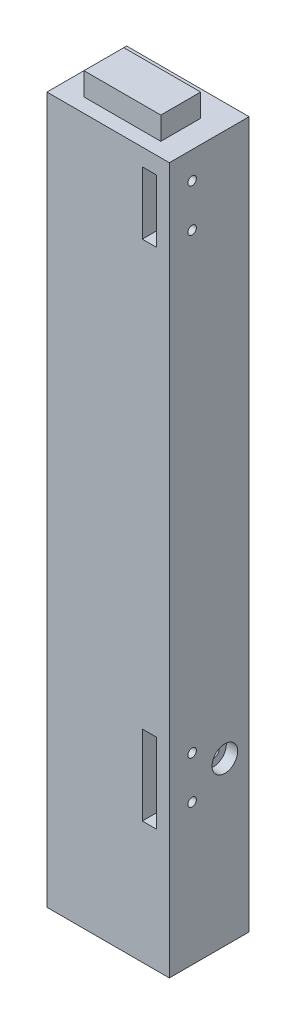
ISO-10303-21;
HEADER;
FILE_DESCRIPTION(('STEP AP214'),'2;1');
FILE_NAME('part.step','',(''),(''),'','','');
FILE_SCHEMA(('AUTOMOTIVE_DESIGN { 1 0 10303 214 1 1 1 1 }'));
ENDSEC;
DATA;
#1=APPLICATION_CONTEXT('core data for automotive mechanical design processes');
#2=APPLICATION_PROTOCOL_DEFINITION('international standard','automotive_design',2000,#1);
#3=PRODUCT_CONTEXT('',#1,'mechanical');
#4=PRODUCT('Part','Part','',(#3));
#5=PRODUCT_RELATED_PRODUCT_CATEGORY('part','',(#4));
#6=PRODUCT_DEFINITION_FORMATION('','',#4);
#7=PRODUCT_DEFINITION_CONTEXT('part definition',#1,'design');
#8=PRODUCT_DEFINITION('design','',#6,#7);
#9=PRODUCT_DEFINITION_SHAPE('','',#8);
#10=(LENGTH_UNIT() NAMED_UNIT(*) SI_UNIT(.MILLI.,.METRE.));
#11=(NAMED_UNIT(*) PLANE_ANGLE_UNIT() SI_UNIT($,.RADIAN.));
#12=(NAMED_UNIT(*) SI_UNIT($,.STERADIAN.) SOLID_ANGLE_UNIT());
#13=UNCERTAINTY_MEASURE_WITH_UNIT(LENGTH_MEASURE(1.E-05),#10,'distance_accuracy_value','');
#14=(GEOMETRIC_REPRESENTATION_CONTEXT(3) GLOBAL_UNCERTAINTY_ASSIGNED_CONTEXT((#13)) GLOBAL_UNIT_ASSIGNED_CONTEXT((#10,
#11,#12)) REPRESENTATION_CONTEXT('',''));
#15=CARTESIAN_POINT('',(0.,0.,0.));
#16=DIRECTION('',(0.,0.,1.));
#17=DIRECTION('',(1.,0.,0.));
#18=AXIS2_PLACEMENT_3D('',#15,#16,#17);
#19=CARTESIAN_POINT('',(68.2625,393.7,88.9));
#20=DIRECTION('',(0.,-1.,0.));
#21=DIRECTION('',(0.,0.,-1.));
#22=AXIS2_PLACEMENT_3D('',#19,#20,#21);
#23=PLANE('',#22);
#24=DIRECTION('',(-1.,0.,0.));
#25=VECTOR('',#24,1.);
#26=CARTESIAN_POINT('',(68.2625,393.7,0.));
#27=LINE('',#26,#25);
#28=CARTESIAN_POINT('',(68.2625,393.7,0.));
#29=VERTEX_POINT('',#28);
#30=CARTESIAN_POINT('',(-68.2625,393.7,0.));
#31=VERTEX_POINT('',#30);
#32=EDGE_CURVE('E305',#29,#31,#27,.T.);
#33=ORIENTED_EDGE('',*,*,#32,.T.);
#34=DIRECTION('',(0.,0.,-1.));
#35=VECTOR('',#34,1.);
#36=CARTESIAN_POINT('',(-68.2625,393.7,88.9));
#37=LINE('',#36,#35);
#38=CARTESIAN_POINT('',(-68.2625,393.7,88.9));
#39=VERTEX_POINT('',#38);
#40=EDGE_CURVE('E311',#39,#31,#37,.T.);
#41=ORIENTED_EDGE('',*,*,#40,.F.);
#42=DIRECTION('',(-1.,0.,0.));
#43=VECTOR('',#42,1.);
#44=CARTESIAN_POINT('',(68.2625,393.7,88.9));
#45=LINE('',#44,#43);
#46=CARTESIAN_POINT('',(68.2625,393.7,88.9));
#47=VERTEX_POINT('',#46);
#48=EDGE_CURVE('E309',#47,#39,#45,.T.);
#49=ORIENTED_EDGE('',*,*,#48,.F.);
#50=DIRECTION('',(0.,0.,-1.));
#51=VECTOR('',#50,1.);
#52=CARTESIAN_POINT('',(68.2625,393.7,88.9));
#53=LINE('',#52,#51);
#54=EDGE_CURVE('E321',#47,#29,#53,.T.);
#55=ORIENTED_EDGE('',*,*,#54,.T.);
#56=EDGE_LOOP('',(#33,#41,#49,#55));
#57=FACE_BOUND('',#56,.T.);
#58=DIRECTION('',(0.,0.,1.));
#59=VECTOR('',#58,1.);
#60=CARTESIAN_POINT('',(-42.8625,393.7,73.025));
#61=LINE('',#60,#59);
#62=CARTESIAN_POINT('',(-42.8625,393.7,28.575));
#63=VERTEX_POINT('',#62);
#64=CARTESIAN_POINT('',(-42.8625,393.7,73.025));
#65=VERTEX_POINT('',#64);
#66=EDGE_CURVE('E261',#63,#65,#61,.T.);
#67=ORIENTED_EDGE('',*,*,#66,.F.);
#68=DIRECTION('',(-1.,0.,0.));
#69=VECTOR('',#68,1.);
#70=CARTESIAN_POINT('',(42.8625,393.7,28.575));
#71=LINE('',#70,#69);
#72=CARTESIAN_POINT('',(42.8625,393.7,28.575));
#73=VERTEX_POINT('',#72);
#74=EDGE_CURVE('E272',#73,#63,#71,.T.);
#75=ORIENTED_EDGE('',*,*,#74,.F.);
#76=DIRECTION('',(0.,0.,-1.));
#77=VECTOR('',#76,1.);
#78=CARTESIAN_POINT('',(42.8625,393.7,73.025));
#79=LINE('',#78,#77);
#80=CARTESIAN_POINT('',(42.8625,393.7,73.025));
#81=VERTEX_POINT('',#80);
#82=EDGE_CURVE('E284',#81,#73,#79,.T.);
#83=ORIENTED_EDGE('',*,*,#82,.F.);
#84=DIRECTION('',(1.,0.,0.));
#85=VECTOR('',#84,1.);
#86=CARTESIAN_POINT('',(42.8625,393.7,73.025));
#87=LINE('',#86,#85);
#88=EDGE_CURVE('E281',#65,#81,#87,.T.);
#89=ORIENTED_EDGE('',*,*,#88,.F.);
#90=EDGE_LOOP('',(#67,#75,#83,#89));
#91=FACE_BOUND('',#90,.T.);
#92=ADVANCED_FACE('F33',(#57,#91),#23,.F.);
#93=CARTESIAN_POINT('',(-68.2625,393.7,88.9));
#94=DIRECTION('',(1.,0.,0.));
#95=DIRECTION('',(0.,1.,0.));
#96=AXIS2_PLACEMENT_3D('',#93,#94,#95);
#97=PLANE('',#96);
#98=DIRECTION('',(0.,0.,1.));
#99=VECTOR('',#98,1.);
#100=CARTESIAN_POINT('',(-68.2625,-254.,39.6875));
#101=LINE('',#100,#99);
#102=CARTESIAN_POINT('',(-68.2625,-254.,14.2875));
#103=VERTEX_POINT('',#102);
#104=CARTESIAN_POINT('',(-68.2625,-254.,39.6875));
#105=VERTEX_POINT('',#104);
#106=EDGE_CURVE('E251',#103,#105,#101,.T.);
#107=ORIENTED_EDGE('',*,*,#106,.F.);
#108=DIRECTION('',(0.,-1.,0.));
#109=VECTOR('',#108,1.);
#110=CARTESIAN_POINT('',(-68.2625,-171.45,14.2875));
#111=LINE('',#110,#109);
#112=CARTESIAN_POINT('',(-68.2625,-171.45,14.2875));
#113=VERTEX_POINT('',#112);
#114=EDGE_CURVE('E230',#113,#103,#111,.T.);
#115=ORIENTED_EDGE('',*,*,#114,.F.);
#116=DIRECTION('',(0.,0.,-1.));
#117=VECTOR('',#116,1.);
#118=CARTESIAN_POINT('',(-68.2625,-171.45,39.6875));
#119=LINE('',#118,#117);
#120=CARTESIAN_POINT('',(-68.2625,-171.45,39.6875));
#121=VERTEX_POINT('',#120);
#122=EDGE_CURVE('E240',#121,#113,#119,.T.);
#123=ORIENTED_EDGE('',*,*,#122,.F.);
#124=DIRECTION('',(0.,1.,0.));
#125=VECTOR('',#124,1.);
#126=CARTESIAN_POINT('',(-68.2625,-171.45,39.6875));
#127=LINE('',#126,#125);
#128=EDGE_CURVE('E254',#105,#121,#127,.T.);
#129=ORIENTED_EDGE('',*,*,#128,.F.);
#130=EDGE_LOOP('',(#107,#115,#123,#129));
#131=FACE_BOUND('',#130,.T.);
#132=DIRECTION('',(0.,-1.,0.));
#133=VECTOR('',#132,1.);
#134=CARTESIAN_POINT('',(-68.2625,393.7,0.));
#135=LINE('',#134,#133);
#136=CARTESIAN_POINT('',(-68.2625,-393.7,0.));
#137=VERTEX_POINT('',#136);
#138=EDGE_CURVE('E300',#31,#137,#135,.T.);
#139=ORIENTED_EDGE('',*,*,#138,.T.);
#140=DIRECTION('',(0.,0.,-1.));
#141=VECTOR('',#140,1.);
#142=CARTESIAN_POINT('',(-68.2625,-393.7,88.9));
#143=LINE('',#142,#141);
#144=CARTESIAN_POINT('',(-68.2625,-393.7,88.9));
#145=VERTEX_POINT('',#144);
#146=EDGE_CURVE('E11',#145,#137,#143,.T.);
#147=ORIENTED_EDGE('',*,*,#146,.F.);
#148=DIRECTION('',(0.,-1.,0.));
#149=VECTOR('',#148,1.);
#150=CARTESIAN_POINT('',(-68.2625,393.7,88.9));
#151=LINE('',#150,#149);
#152=EDGE_CURVE('E301',#39,#145,#151,.T.);
#153=ORIENTED_EDGE('',*,*,#152,.F.);
#154=ORIENTED_EDGE('',*,*,#40,.T.);
#155=EDGE_LOOP('',(#139,#147,#153,#154));
#156=FACE_BOUND('',#155,.T.);
#157=ADVANCED_FACE('F35',(#131,#156),#97,.F.);
#158=CARTESIAN_POINT('',(68.2625000000001,-393.7,88.9));
#159=DIRECTION('',(0.,1.,0.));
#160=DIRECTION('',(-1.,0.,0.));
#161=AXIS2_PLACEMENT_3D('',#158,#159,#160);
#162=PLANE('',#161);
#163=DIRECTION('',(1.,0.,0.));
#164=VECTOR('',#163,1.);
#165=CARTESIAN_POINT('',(68.2625000000001,-393.7,0.));
#166=LINE('',#165,#164);
#167=CARTESIAN_POINT('',(68.2625000000001,-393.7,0.));
#168=VERTEX_POINT('',#167);
#169=EDGE_CURVE('E314',#137,#168,#166,.T.);
#170=ORIENTED_EDGE('',*,*,#169,.T.);
#171=DIRECTION('',(0.,0.,-1.));
#172=VECTOR('',#171,1.);
#173=CARTESIAN_POINT('',(68.2625000000001,-393.7,88.9));
#174=LINE('',#173,#172);
#175=CARTESIAN_POINT('',(68.2625000000001,-393.7,88.9));
#176=VERTEX_POINT('',#175);
#177=EDGE_CURVE('E42',#176,#168,#174,.T.);
#178=ORIENTED_EDGE('',*,*,#177,.F.);
#179=DIRECTION('',(1.,0.,0.));
#180=VECTOR('',#179,1.);
#181=CARTESIAN_POINT('',(68.2625000000001,-393.7,88.9));
#182=LINE('',#181,#180);
#183=EDGE_CURVE('E304',#145,#176,#182,.T.);
#184=ORIENTED_EDGE('',*,*,#183,.F.);
#185=ORIENTED_EDGE('',*,*,#146,.T.);
#186=EDGE_LOOP('',(#170,#178,#184,#185));
#187=FACE_BOUND('',#186,.T.);
#188=ADVANCED_FACE('F391',(#187),#162,.F.);
#189=CARTESIAN_POINT('',(68.2625,393.7,88.9));
#190=DIRECTION('',(-1.,0.,0.));
#191=DIRECTION('',(0.,-1.,0.));
#192=AXIS2_PLACEMENT_3D('',#189,#190,#191);
#193=PLANE('',#192);
#194=CARTESIAN_POINT('',(68.2625,-212.725,26.9875));
#195=DIRECTION('',(1.,0.,0.));
#196=DIRECTION('',(0.,1.,0.));
#197=AXIS2_PLACEMENT_3D('',#194,#195,#196);
#198=CIRCLE('',#197,14.2875);
#199=CARTESIAN_POINT('',(68.2625,-198.4375,26.9875));
#200=VERTEX_POINT('',#199);
#201=EDGE_CURVE('E679',#200,#200,#198,.T.);
#202=ORIENTED_EDGE('',*,*,#201,.F.);
#203=EDGE_LOOP('',(#202));
#204=FACE_BOUND('',#203,.T.);
#205=CARTESIAN_POINT('',(68.2625,-188.9125,63.5));
#206=DIRECTION('',(1.,0.,0.));
#207=DIRECTION('',(0.,1.,0.));
#208=AXIS2_PLACEMENT_3D('',#205,#206,#207);
#209=CIRCLE('',#208,4.7625);
#210=CARTESIAN_POINT('',(68.2625,-184.15,63.5));
#211=VERTEX_POINT('',#210);
#212=EDGE_CURVE('E334',#211,#211,#209,.T.);
#213=ORIENTED_EDGE('',*,*,#212,.F.);
#214=EDGE_LOOP('',(#213));
#215=FACE_BOUND('',#214,.T.);
#216=CARTESIAN_POINT('',(68.2625,315.9125,63.5));
#217=DIRECTION('',(1.,0.,0.));
#218=DIRECTION('',(0.,1.,0.));
#219=AXIS2_PLACEMENT_3D('',#216,#217,#218);
#220=CIRCLE('',#219,4.7625);
#221=CARTESIAN_POINT('',(68.2625,320.675,63.5));
#222=VERTEX_POINT('',#221);
#223=EDGE_CURVE('E693',#222,#222,#220,.T.);
#224=ORIENTED_EDGE('',*,*,#223,.F.);
#225=EDGE_LOOP('',(#224));
#226=FACE_BOUND('',#225,.T.);
#227=CARTESIAN_POINT('',(68.2625,363.5375,63.5));
#228=DIRECTION('',(1.,0.,0.));
#229=DIRECTION('',(0.,1.,0.));
#230=AXIS2_PLACEMENT_3D('',#227,#228,#229);
#231=CIRCLE('',#230,4.7625);
#232=CARTESIAN_POINT('',(68.2625,368.3,63.5));
#233=VERTEX_POINT('',#232);
#234=EDGE_CURVE('E699',#233,#233,#231,.T.);
#235=ORIENTED_EDGE('',*,*,#234,.F.);
#236=EDGE_LOOP('',(#235));
#237=FACE_BOUND('',#236,.T.);
#238=CARTESIAN_POINT('',(68.2625,-236.5375,63.5));
#239=DIRECTION('',(1.,0.,0.));
#240=DIRECTION('',(0.,1.,0.));
#241=AXIS2_PLACEMENT_3D('',#238,#239,#240);
#242=CIRCLE('',#241,4.7625);
#243=CARTESIAN_POINT('',(68.2625,-231.775,63.5));
#244=VERTEX_POINT('',#243);
#245=EDGE_CURVE('E344',#244,#244,#242,.T.);
#246=ORIENTED_EDGE('',*,*,#245,.F.);
#247=EDGE_LOOP('',(#246));
#248=FACE_BOUND('',#247,.T.);
#249=DIRECTION('',(0.,1.,0.));
#250=VECTOR('',#249,1.);
#251=CARTESIAN_POINT('',(68.2625,393.7,0.));
#252=LINE('',#251,#250);
#253=EDGE_CURVE('E316',#168,#29,#252,.T.);
#254=ORIENTED_EDGE('',*,*,#253,.T.);
#255=ORIENTED_EDGE('',*,*,#54,.F.);
#256=DIRECTION('',(0.,1.,0.));
#257=VECTOR('',#256,1.);
#258=CARTESIAN_POINT('',(68.2625,393.7,88.9));
#259=LINE('',#258,#257);
#260=EDGE_CURVE('E307',#176,#47,#259,.T.);
#261=ORIENTED_EDGE('',*,*,#260,.F.);
#262=ORIENTED_EDGE('',*,*,#177,.T.);
#263=EDGE_LOOP('',(#254,#255,#261,#262));
#264=FACE_BOUND('',#263,.T.);
#265=ADVANCED_FACE('F398',(#204,#215,#226,#237,#248,#264),#193,.F.);
#266=CARTESIAN_POINT('',(0.,0.,88.9));
#267=DIRECTION('',(0.,0.,-1.));
#268=DIRECTION('',(-1.,0.,0.));
#269=AXIS2_PLACEMENT_3D('',#266,#267,#268);
#270=PLANE('',#269);
#271=DIRECTION('',(0.,-1.,0.));
#272=VECTOR('',#271,1.);
#273=CARTESIAN_POINT('',(38.1,374.65,88.9));
#274=LINE('',#273,#272);
#275=CARTESIAN_POINT('',(38.1,374.65,88.9));
#276=VERTEX_POINT('',#275);
#277=CARTESIAN_POINT('',(38.1,304.8,88.9));
#278=VERTEX_POINT('',#277);
#279=EDGE_CURVE('E193',#276,#278,#274,.T.);
#280=ORIENTED_EDGE('',*,*,#279,.F.);
#281=DIRECTION('',(-1.,0.,0.));
#282=VECTOR('',#281,1.);
#283=CARTESIAN_POINT('',(53.975,374.65,88.9));
#284=LINE('',#283,#282);
#285=CARTESIAN_POINT('',(53.975,374.65,88.9));
#286=VERTEX_POINT('',#285);
#287=EDGE_CURVE('E50',#286,#276,#284,.T.);
#288=ORIENTED_EDGE('',*,*,#287,.F.);
#289=DIRECTION('',(0.,-1.,0.));
#290=VECTOR('',#289,1.);
#291=CARTESIAN_POINT('',(53.975,374.65,88.9));
#292=LINE('',#291,#290);
#293=CARTESIAN_POINT('',(53.975,304.8,88.9));
#294=VERTEX_POINT('',#293);
#295=EDGE_CURVE('E181',#286,#294,#292,.T.);
#296=ORIENTED_EDGE('',*,*,#295,.T.);
#297=DIRECTION('',(-1.,0.,0.));
#298=VECTOR('',#297,1.);
#299=CARTESIAN_POINT('',(53.975,304.8,88.9));
#300=LINE('',#299,#298);
#301=EDGE_CURVE('E187',#294,#278,#300,.T.);
#302=ORIENTED_EDGE('',*,*,#301,.T.);
#303=EDGE_LOOP('',(#280,#288,#296,#302));
#304=FACE_BOUND('',#303,.T.);
#305=DIRECTION('',(0.,-1.,0.));
#306=VECTOR('',#305,1.);
#307=CARTESIAN_POINT('',(38.1000000000001,-168.275,88.9));
#308=LINE('',#307,#306);
#309=CARTESIAN_POINT('',(38.1000000000001,-168.275,88.9));
#310=VERTEX_POINT('',#309);
#311=CARTESIAN_POINT('',(38.1000000000001,-257.175,88.9));
#312=VERTEX_POINT('',#311);
#313=EDGE_CURVE('E195',#310,#312,#308,.T.);
#314=ORIENTED_EDGE('',*,*,#313,.F.);
#315=DIRECTION('',(-1.,0.,0.));
#316=VECTOR('',#315,1.);
#317=CARTESIAN_POINT('',(53.9750000000001,-168.275,88.9));
#318=LINE('',#317,#316);
#319=CARTESIAN_POINT('',(53.9750000000001,-168.275,88.9));
#320=VERTEX_POINT('',#319);
#321=EDGE_CURVE('E58',#320,#310,#318,.T.);
#322=ORIENTED_EDGE('',*,*,#321,.F.);
#323=DIRECTION('',(0.,-1.,0.));
#324=VECTOR('',#323,1.);
#325=CARTESIAN_POINT('',(53.9750000000001,-168.275,88.9));
#326=LINE('',#325,#324);
#327=CARTESIAN_POINT('',(53.9750000000001,-257.175,88.9));
#328=VERTEX_POINT('',#327);
#329=EDGE_CURVE('E213',#320,#328,#326,.T.);
#330=ORIENTED_EDGE('',*,*,#329,.T.);
#331=DIRECTION('',(-1.,0.,0.));
#332=VECTOR('',#331,1.);
#333=CARTESIAN_POINT('',(53.9750000000001,-257.175,88.9));
#334=LINE('',#333,#332);
#335=EDGE_CURVE('E223',#328,#312,#334,.T.);
#336=ORIENTED_EDGE('',*,*,#335,.T.);
#337=EDGE_LOOP('',(#314,#322,#330,#336));
#338=FACE_BOUND('',#337,.T.);
#339=ORIENTED_EDGE('',*,*,#152,.T.);
#340=ORIENTED_EDGE('',*,*,#183,.T.);
#341=ORIENTED_EDGE('',*,*,#260,.T.);
#342=ORIENTED_EDGE('',*,*,#48,.T.);
#343=EDGE_LOOP('',(#339,#340,#341,#342));
#344=FACE_BOUND('',#343,.T.);
#345=ADVANCED_FACE('F190',(#304,#338,#344),#270,.F.);
#346=CARTESIAN_POINT('',(0.,0.,0.));
#347=DIRECTION('',(0.,0.,-1.));
#348=DIRECTION('',(-1.,0.,0.));
#349=AXIS2_PLACEMENT_3D('',#346,#347,#348);
#350=PLANE('',#349);
#351=ORIENTED_EDGE('',*,*,#138,.F.);
#352=ORIENTED_EDGE('',*,*,#32,.F.);
#353=ORIENTED_EDGE('',*,*,#253,.F.);
#354=ORIENTED_EDGE('',*,*,#169,.F.);
#355=EDGE_LOOP('',(#351,#352,#353,#354));
#356=FACE_BOUND('',#355,.T.);
#357=ADVANCED_FACE('F396',(#356),#350,.T.);
#358=CARTESIAN_POINT('',(-42.8625,419.1,73.025));
#359=DIRECTION('',(1.,0.,0.));
#360=DIRECTION('',(0.,0.,-1.));
#361=AXIS2_PLACEMENT_3D('',#358,#359,#360);
#362=PLANE('',#361);
#363=ORIENTED_EDGE('',*,*,#66,.T.);
#364=DIRECTION('',(0.,-1.,0.));
#365=VECTOR('',#364,1.);
#366=CARTESIAN_POINT('',(-42.8625,419.1,73.025));
#367=LINE('',#366,#365);
#368=CARTESIAN_POINT('',(-42.8625,419.1,73.025));
#369=VERTEX_POINT('',#368);
#370=EDGE_CURVE('E297',#369,#65,#367,.T.);
#371=ORIENTED_EDGE('',*,*,#370,.F.);
#372=DIRECTION('',(0.,0.,1.));
#373=VECTOR('',#372,1.);
#374=CARTESIAN_POINT('',(-42.8625,419.1,73.025));
#375=LINE('',#374,#373);
#376=CARTESIAN_POINT('',(-42.8625,419.1,28.575));
#377=VERTEX_POINT('',#376);
#378=EDGE_CURVE('E268',#377,#369,#375,.T.);
#379=ORIENTED_EDGE('',*,*,#378,.F.);
#380=DIRECTION('',(0.,-1.,0.));
#381=VECTOR('',#380,1.);
#382=CARTESIAN_POINT('',(-42.8625,419.1,28.575));
#383=LINE('',#382,#381);
#384=EDGE_CURVE('E278',#377,#63,#383,.T.);
#385=ORIENTED_EDGE('',*,*,#384,.T.);
#386=EDGE_LOOP('',(#363,#371,#379,#385));
#387=FACE_BOUND('',#386,.T.);
#388=ADVANCED_FACE('F423',(#387),#362,.F.);
#389=CARTESIAN_POINT('',(42.8625,419.1,73.025));
#390=DIRECTION('',(0.,0.,-1.));
#391=DIRECTION('',(-1.,0.,0.));
#392=AXIS2_PLACEMENT_3D('',#389,#390,#391);
#393=PLANE('',#392);
#394=ORIENTED_EDGE('',*,*,#88,.T.);
#395=DIRECTION('',(0.,-1.,0.));
#396=VECTOR('',#395,1.);
#397=CARTESIAN_POINT('',(42.8625,419.1,73.025));
#398=LINE('',#397,#396);
#399=CARTESIAN_POINT('',(42.8625,419.1,73.025));
#400=VERTEX_POINT('',#399);
#401=EDGE_CURVE('E294',#400,#81,#398,.T.);
#402=ORIENTED_EDGE('',*,*,#401,.F.);
#403=DIRECTION('',(1.,0.,0.));
#404=VECTOR('',#403,1.);
#405=CARTESIAN_POINT('',(42.8625,419.1,73.025));
#406=LINE('',#405,#404);
#407=EDGE_CURVE('E271',#369,#400,#406,.T.);
#408=ORIENTED_EDGE('',*,*,#407,.F.);
#409=ORIENTED_EDGE('',*,*,#370,.T.);
#410=EDGE_LOOP('',(#394,#402,#408,#409));
#411=FACE_BOUND('',#410,.T.);
#412=ADVANCED_FACE('F427',(#411),#393,.F.);
#413=CARTESIAN_POINT('',(42.8625,419.1,73.025));
#414=DIRECTION('',(-1.,0.,0.));
#415=DIRECTION('',(0.,0.,1.));
#416=AXIS2_PLACEMENT_3D('',#413,#414,#415);
#417=PLANE('',#416);
#418=ORIENTED_EDGE('',*,*,#82,.T.);
#419=DIRECTION('',(0.,-1.,0.));
#420=VECTOR('',#419,1.);
#421=CARTESIAN_POINT('',(42.8625,419.1,28.575));
#422=LINE('',#421,#420);
#423=CARTESIAN_POINT('',(42.8625,419.1,28.575));
#424=VERTEX_POINT('',#423);
#425=EDGE_CURVE('E291',#424,#73,#422,.T.);
#426=ORIENTED_EDGE('',*,*,#425,.F.);
#427=DIRECTION('',(0.,0.,-1.));
#428=VECTOR('',#427,1.);
#429=CARTESIAN_POINT('',(42.8625,419.1,73.025));
#430=LINE('',#429,#428);
#431=EDGE_CURVE('E274',#400,#424,#430,.T.);
#432=ORIENTED_EDGE('',*,*,#431,.F.);
#433=ORIENTED_EDGE('',*,*,#401,.T.);
#434=EDGE_LOOP('',(#418,#426,#432,#433));
#435=FACE_BOUND('',#434,.T.);
#436=ADVANCED_FACE('F431',(#435),#417,.F.);
#437=CARTESIAN_POINT('',(42.8625,419.1,28.575));
#438=DIRECTION('',(0.,0.,1.));
#439=DIRECTION('',(1.,0.,0.));
#440=AXIS2_PLACEMENT_3D('',#437,#438,#439);
#441=PLANE('',#440);
#442=ORIENTED_EDGE('',*,*,#74,.T.);
#443=ORIENTED_EDGE('',*,*,#384,.F.);
#444=DIRECTION('',(-1.,0.,0.));
#445=VECTOR('',#444,1.);
#446=CARTESIAN_POINT('',(42.8625,419.1,28.575));
#447=LINE('',#446,#445);
#448=EDGE_CURVE('E276',#424,#377,#447,.T.);
#449=ORIENTED_EDGE('',*,*,#448,.F.);
#450=ORIENTED_EDGE('',*,*,#425,.T.);
#451=EDGE_LOOP('',(#442,#443,#449,#450));
#452=FACE_BOUND('',#451,.T.);
#453=ADVANCED_FACE('F435',(#452),#441,.F.);
#454=CARTESIAN_POINT('',(0.,419.1,0.));
#455=DIRECTION('',(0.,1.,0.));
#456=DIRECTION('',(0.,0.,1.));
#457=AXIS2_PLACEMENT_3D('',#454,#455,#456);
#458=PLANE('',#457);
#459=ORIENTED_EDGE('',*,*,#378,.T.);
#460=ORIENTED_EDGE('',*,*,#407,.T.);
#461=ORIENTED_EDGE('',*,*,#431,.T.);
#462=ORIENTED_EDGE('',*,*,#448,.T.);
#463=EDGE_LOOP('',(#459,#460,#461,#462));
#464=FACE_BOUND('',#463,.T.);
#465=ADVANCED_FACE('F439',(#464),#458,.T.);
#466=CARTESIAN_POINT('',(-17.4625,-171.45,14.2875));
#467=DIRECTION('',(0.,0.,-1.));
#468=DIRECTION('',(0.,1.,0.));
#469=AXIS2_PLACEMENT_3D('',#466,#467,#468);
#470=PLANE('',#469);
#471=ORIENTED_EDGE('',*,*,#114,.T.);
#472=DIRECTION('',(-1.,0.,0.));
#473=VECTOR('',#472,1.);
#474=CARTESIAN_POINT('',(-17.4625,-254.,14.2875));
#475=LINE('',#474,#473);
#476=CARTESIAN_POINT('',(-17.4625,-254.,14.2875));
#477=VERTEX_POINT('',#476);
#478=EDGE_CURVE('E249',#477,#103,#475,.T.);
#479=ORIENTED_EDGE('',*,*,#478,.F.);
#480=DIRECTION('',(0.,-1.,0.));
#481=VECTOR('',#480,1.);
#482=CARTESIAN_POINT('',(-17.4625,-171.45,14.2875));
#483=LINE('',#482,#481);
#484=CARTESIAN_POINT('',(-17.4625,-171.45,14.2875));
#485=VERTEX_POINT('',#484);
#486=EDGE_CURVE('E236',#485,#477,#483,.T.);
#487=ORIENTED_EDGE('',*,*,#486,.F.);
#488=DIRECTION('',(-1.,0.,0.));
#489=VECTOR('',#488,1.);
#490=CARTESIAN_POINT('',(-17.4625,-171.45,14.2875));
#491=LINE('',#490,#489);
#492=EDGE_CURVE('E259',#485,#113,#491,.T.);
#493=ORIENTED_EDGE('',*,*,#492,.T.);
#494=EDGE_LOOP('',(#471,#479,#487,#493));
#495=FACE_BOUND('',#494,.T.);
#496=ADVANCED_FACE('F443',(#495),#470,.F.);
#497=CARTESIAN_POINT('',(-17.4625,-171.45,39.6875));
#498=DIRECTION('',(0.,1.,0.));
#499=DIRECTION('',(-1.,0.,0.));
#500=AXIS2_PLACEMENT_3D('',#497,#498,#499);
#501=PLANE('',#500);
#502=ORIENTED_EDGE('',*,*,#122,.T.);
#503=ORIENTED_EDGE('',*,*,#492,.F.);
#504=DIRECTION('',(0.,0.,-1.));
#505=VECTOR('',#504,1.);
#506=CARTESIAN_POINT('',(-17.4625,-171.45,39.6875));
#507=LINE('',#506,#505);
#508=CARTESIAN_POINT('',(-17.4625,-171.45,39.6875));
#509=VERTEX_POINT('',#508);
#510=EDGE_CURVE('E246',#509,#485,#507,.T.);
#511=ORIENTED_EDGE('',*,*,#510,.F.);
#512=DIRECTION('',(-1.,0.,0.));
#513=VECTOR('',#512,1.);
#514=CARTESIAN_POINT('',(-17.4625,-171.45,39.6875));
#515=LINE('',#514,#513);
#516=EDGE_CURVE('E262',#509,#121,#515,.T.);
#517=ORIENTED_EDGE('',*,*,#516,.T.);
#518=EDGE_LOOP('',(#502,#503,#511,#517));
#519=FACE_BOUND('',#518,.T.);
#520=ADVANCED_FACE('F447',(#519),#501,.F.);
#521=CARTESIAN_POINT('',(-17.4625,-171.45,39.6875));
#522=DIRECTION('',(0.,0.,1.));
#523=DIRECTION('',(0.,-1.,0.));
#524=AXIS2_PLACEMENT_3D('',#521,#522,#523);
#525=PLANE('',#524);
#526=ORIENTED_EDGE('',*,*,#128,.T.);
#527=ORIENTED_EDGE('',*,*,#516,.F.);
#528=DIRECTION('',(0.,1.,0.));
#529=VECTOR('',#528,1.);
#530=CARTESIAN_POINT('',(-17.4625,-171.45,39.6875));
#531=LINE('',#530,#529);
#532=CARTESIAN_POINT('',(-17.4625,-254.,39.6875));
#533=VERTEX_POINT('',#532);
#534=EDGE_CURVE('E243',#533,#509,#531,.T.);
#535=ORIENTED_EDGE('',*,*,#534,.F.);
#536=DIRECTION('',(-1.,0.,0.));
#537=VECTOR('',#536,1.);
#538=CARTESIAN_POINT('',(-17.4625,-254.,39.6875));
#539=LINE('',#538,#537);
#540=EDGE_CURVE('E264',#533,#105,#539,.T.);
#541=ORIENTED_EDGE('',*,*,#540,.T.);
#542=EDGE_LOOP('',(#526,#527,#535,#541));
#543=FACE_BOUND('',#542,.T.);
#544=ADVANCED_FACE('F453',(#543),#525,.F.);
#545=CARTESIAN_POINT('',(-17.4625,-254.,39.6875));
#546=DIRECTION('',(0.,-1.,0.));
#547=DIRECTION('',(1.,0.,0.));
#548=AXIS2_PLACEMENT_3D('',#545,#546,#547);
#549=PLANE('',#548);
#550=ORIENTED_EDGE('',*,*,#106,.T.);
#551=ORIENTED_EDGE('',*,*,#540,.F.);
#552=DIRECTION('',(0.,0.,1.));
#553=VECTOR('',#552,1.);
#554=CARTESIAN_POINT('',(-17.4625,-254.,39.6875));
#555=LINE('',#554,#553);
#556=EDGE_CURVE('E239',#477,#533,#555,.T.);
#557=ORIENTED_EDGE('',*,*,#556,.F.);
#558=ORIENTED_EDGE('',*,*,#478,.T.);
#559=EDGE_LOOP('',(#550,#551,#557,#558));
#560=FACE_BOUND('',#559,.T.);
#561=ADVANCED_FACE('F449',(#560),#549,.F.);
#562=CARTESIAN_POINT('',(-17.4625,0.,0.));
#563=DIRECTION('',(1.,0.,0.));
#564=DIRECTION('',(0.,1.,0.));
#565=AXIS2_PLACEMENT_3D('',#562,#563,#564);
#566=PLANE('',#565);
#567=CARTESIAN_POINT('',(-17.4625,-212.725,26.9875));
#568=DIRECTION('',(1.,0.,0.));
#569=DIRECTION('',(0.,1.,0.));
#570=AXIS2_PLACEMENT_3D('',#567,#568,#569);
#571=CIRCLE('',#570,6.35);
#572=CARTESIAN_POINT('',(-17.4625,-206.375,26.9875));
#573=VERTEX_POINT('',#572);
#574=EDGE_CURVE('E678',#573,#573,#571,.T.);
#575=ORIENTED_EDGE('',*,*,#574,.T.);
#576=EDGE_LOOP('',(#575));
#577=FACE_BOUND('',#576,.T.);
#578=ORIENTED_EDGE('',*,*,#486,.T.);
#579=ORIENTED_EDGE('',*,*,#556,.T.);
#580=ORIENTED_EDGE('',*,*,#534,.T.);
#581=ORIENTED_EDGE('',*,*,#510,.T.);
#582=EDGE_LOOP('',(#578,#579,#580,#581));
#583=FACE_BOUND('',#582,.T.);
#584=ADVANCED_FACE('F452',(#577,#583),#566,.F.);
#585=CARTESIAN_POINT('',(53.9750000000001,-168.275,38.1));
#586=DIRECTION('',(0.,1.,0.));
#587=DIRECTION('',(0.,0.,1.));
#588=AXIS2_PLACEMENT_3D('',#585,#586,#587);
#589=PLANE('',#588);
#590=ORIENTED_EDGE('',*,*,#321,.T.);
#591=DIRECTION('',(0.,0.,1.));
#592=VECTOR('',#591,1.);
#593=CARTESIAN_POINT('',(38.1000000000001,-168.275,38.1));
#594=LINE('',#593,#592);
#595=CARTESIAN_POINT('',(38.1000000000001,-168.275,38.1));
#596=VERTEX_POINT('',#595);
#597=EDGE_CURVE('E219',#596,#310,#594,.T.);
#598=ORIENTED_EDGE('',*,*,#597,.F.);
#599=DIRECTION('',(-1.,0.,0.));
#600=VECTOR('',#599,1.);
#601=CARTESIAN_POINT('',(53.9750000000001,-168.275,38.1));
#602=LINE('',#601,#600);
#603=CARTESIAN_POINT('',(53.9750000000001,-168.275,38.1));
#604=VERTEX_POINT('',#603);
#605=EDGE_CURVE('E209',#604,#596,#602,.T.);
#606=ORIENTED_EDGE('',*,*,#605,.F.);
#607=DIRECTION('',(0.,0.,1.));
#608=VECTOR('',#607,1.);
#609=CARTESIAN_POINT('',(53.9750000000001,-168.275,38.1));
#610=LINE('',#609,#608);
#611=EDGE_CURVE('E228',#604,#320,#610,.T.);
#612=ORIENTED_EDGE('',*,*,#611,.T.);
#613=EDGE_LOOP('',(#590,#598,#606,#612));
#614=FACE_BOUND('',#613,.T.);
#615=ADVANCED_FACE('F463',(#614),#589,.F.);
#616=CARTESIAN_POINT('',(53.9750000000001,-168.275,38.1));
#617=DIRECTION('',(-1.,0.,0.));
#618=DIRECTION('',(0.,-1.,0.));
#619=AXIS2_PLACEMENT_3D('',#616,#617,#618);
#620=PLANE('',#619);
#621=CARTESIAN_POINT('',(53.9750000000001,-188.9125,63.5));
#622=DIRECTION('',(-1.,0.,0.));
#623=DIRECTION('',(0.,-1.,0.));
#624=AXIS2_PLACEMENT_3D('',#621,#622,#623);
#625=CIRCLE('',#624,4.7625);
#626=CARTESIAN_POINT('',(53.9750000000001,-193.675,63.5));
#627=VERTEX_POINT('',#626);
#628=EDGE_CURVE('E340',#627,#627,#625,.T.);
#629=ORIENTED_EDGE('',*,*,#628,.F.);
#630=EDGE_LOOP('',(#629));
#631=FACE_BOUND('',#630,.T.);
#632=CARTESIAN_POINT('',(53.9750000000001,-236.5375,63.5));
#633=DIRECTION('',(-1.,0.,0.));
#634=DIRECTION('',(0.,-1.,0.));
#635=AXIS2_PLACEMENT_3D('',#632,#633,#634);
#636=CIRCLE('',#635,4.7625);
#637=CARTESIAN_POINT('',(53.9750000000001,-241.3,63.5));
#638=VERTEX_POINT('',#637);
#639=EDGE_CURVE('E178',#638,#638,#636,.T.);
#640=ORIENTED_EDGE('',*,*,#639,.F.);
#641=EDGE_LOOP('',(#640));
#642=FACE_BOUND('',#641,.T.);
#643=ORIENTED_EDGE('',*,*,#329,.F.);
#644=ORIENTED_EDGE('',*,*,#611,.F.);
#645=DIRECTION('',(0.,-1.,0.));
#646=VECTOR('',#645,1.);
#647=CARTESIAN_POINT('',(53.9750000000001,-168.275,38.1));
#648=LINE('',#647,#646);
#649=CARTESIAN_POINT('',(53.9750000000001,-257.175,38.1));
#650=VERTEX_POINT('',#649);
#651=EDGE_CURVE('E218',#604,#650,#648,.T.);
#652=ORIENTED_EDGE('',*,*,#651,.T.);
#653=DIRECTION('',(0.,0.,1.));
#654=VECTOR('',#653,1.);
#655=CARTESIAN_POINT('',(53.9750000000001,-257.175,38.1));
#656=LINE('',#655,#654);
#657=EDGE_CURVE('E231',#650,#328,#656,.T.);
#658=ORIENTED_EDGE('',*,*,#657,.T.);
#659=EDGE_LOOP('',(#643,#644,#652,#658));
#660=FACE_BOUND('',#659,.T.);
#661=ADVANCED_FACE('F467',(#631,#642,#660),#620,.T.);
#662=CARTESIAN_POINT('',(53.9750000000001,-257.175,38.1));
#663=DIRECTION('',(0.,1.,0.));
#664=DIRECTION('',(0.,0.,1.));
#665=AXIS2_PLACEMENT_3D('',#662,#663,#664);
#666=PLANE('',#665);
#667=ORIENTED_EDGE('',*,*,#335,.F.);
#668=ORIENTED_EDGE('',*,*,#657,.F.);
#669=DIRECTION('',(-1.,0.,0.));
#670=VECTOR('',#669,1.);
#671=CARTESIAN_POINT('',(53.9750000000001,-257.175,38.1));
#672=LINE('',#671,#670);
#673=CARTESIAN_POINT('',(38.1000000000001,-257.175,38.1));
#674=VERTEX_POINT('',#673);
#675=EDGE_CURVE('E216',#650,#674,#672,.T.);
#676=ORIENTED_EDGE('',*,*,#675,.T.);
#677=DIRECTION('',(0.,0.,1.));
#678=VECTOR('',#677,1.);
#679=CARTESIAN_POINT('',(38.1000000000001,-257.175,38.1));
#680=LINE('',#679,#678);
#681=EDGE_CURVE('E233',#674,#312,#680,.T.);
#682=ORIENTED_EDGE('',*,*,#681,.T.);
#683=EDGE_LOOP('',(#667,#668,#676,#682));
#684=FACE_BOUND('',#683,.T.);
#685=ADVANCED_FACE('F472',(#684),#666,.T.);
#686=CARTESIAN_POINT('',(38.1000000000001,-168.275,38.1));
#687=DIRECTION('',(-1.,0.,0.));
#688=DIRECTION('',(0.,-1.,0.));
#689=AXIS2_PLACEMENT_3D('',#686,#687,#688);
#690=PLANE('',#689);
#691=CARTESIAN_POINT('',(38.1000000000001,-188.9125,63.5));
#692=DIRECTION('',(-1.,0.,0.));
#693=DIRECTION('',(0.,-1.,0.));
#694=AXIS2_PLACEMENT_3D('',#691,#692,#693);
#695=CIRCLE('',#694,4.7625);
#696=CARTESIAN_POINT('',(38.1000000000001,-193.675,63.5));
#697=VERTEX_POINT('',#696);
#698=EDGE_CURVE('E338',#697,#697,#695,.T.);
#699=ORIENTED_EDGE('',*,*,#698,.T.);
#700=EDGE_LOOP('',(#699));
#701=FACE_BOUND('',#700,.T.);
#702=CARTESIAN_POINT('',(38.1000000000001,-236.5375,63.5));
#703=DIRECTION('',(-1.,0.,0.));
#704=DIRECTION('',(0.,-1.,0.));
#705=AXIS2_PLACEMENT_3D('',#702,#703,#704);
#706=CIRCLE('',#705,4.7625);
#707=CARTESIAN_POINT('',(38.1000000000001,-241.3,63.5));
#708=VERTEX_POINT('',#707);
#709=EDGE_CURVE('E326',#708,#708,#706,.T.);
#710=ORIENTED_EDGE('',*,*,#709,.T.);
#711=EDGE_LOOP('',(#710));
#712=FACE_BOUND('',#711,.T.);
#713=ORIENTED_EDGE('',*,*,#313,.T.);
#714=ORIENTED_EDGE('',*,*,#681,.F.);
#715=DIRECTION('',(0.,-1.,0.));
#716=VECTOR('',#715,1.);
#717=CARTESIAN_POINT('',(38.1000000000001,-168.275,38.1));
#718=LINE('',#717,#716);
#719=EDGE_CURVE('E212',#596,#674,#718,.T.);
#720=ORIENTED_EDGE('',*,*,#719,.F.);
#721=ORIENTED_EDGE('',*,*,#597,.T.);
#722=EDGE_LOOP('',(#713,#714,#720,#721));
#723=FACE_BOUND('',#722,.T.);
#724=ADVANCED_FACE('F468',(#701,#712,#723),#690,.F.);
#725=CARTESIAN_POINT('',(0.,0.,38.1));
#726=DIRECTION('',(0.,0.,1.));
#727=DIRECTION('',(1.,0.,0.));
#728=AXIS2_PLACEMENT_3D('',#725,#726,#727);
#729=PLANE('',#728);
#730=ORIENTED_EDGE('',*,*,#605,.T.);
#731=ORIENTED_EDGE('',*,*,#719,.T.);
#732=ORIENTED_EDGE('',*,*,#675,.F.);
#733=ORIENTED_EDGE('',*,*,#651,.F.);
#734=EDGE_LOOP('',(#730,#731,#732,#733));
#735=FACE_BOUND('',#734,.T.);
#736=ADVANCED_FACE('F471',(#735),#729,.T.);
#737=CARTESIAN_POINT('',(53.975,374.65,38.1));
#738=DIRECTION('',(0.,1.,0.));
#739=DIRECTION('',(0.,0.,1.));
#740=AXIS2_PLACEMENT_3D('',#737,#738,#739);
#741=PLANE('',#740);
#742=ORIENTED_EDGE('',*,*,#287,.T.);
#743=DIRECTION('',(0.,0.,1.));
#744=VECTOR('',#743,1.);
#745=CARTESIAN_POINT('',(38.1,374.65,38.1));
#746=LINE('',#745,#744);
#747=CARTESIAN_POINT('',(38.1,374.65,38.1));
#748=VERTEX_POINT('',#747);
#749=EDGE_CURVE('E203',#748,#276,#746,.T.);
#750=ORIENTED_EDGE('',*,*,#749,.F.);
#751=DIRECTION('',(-1.,0.,0.));
#752=VECTOR('',#751,1.);
#753=CARTESIAN_POINT('',(53.975,374.65,38.1));
#754=LINE('',#753,#752);
#755=CARTESIAN_POINT('',(53.975,374.65,38.1));
#756=VERTEX_POINT('',#755);
#757=EDGE_CURVE('E174',#756,#748,#754,.T.);
#758=ORIENTED_EDGE('',*,*,#757,.F.);
#759=DIRECTION('',(0.,0.,1.));
#760=VECTOR('',#759,1.);
#761=CARTESIAN_POINT('',(53.975,374.65,38.1));
#762=LINE('',#761,#760);
#763=EDGE_CURVE('E170',#756,#286,#762,.T.);
#764=ORIENTED_EDGE('',*,*,#763,.T.);
#765=EDGE_LOOP('',(#742,#750,#758,#764));
#766=FACE_BOUND('',#765,.T.);
#767=ADVANCED_FACE('F172',(#766),#741,.F.);
#768=CARTESIAN_POINT('',(53.975,374.65,38.1));
#769=DIRECTION('',(-1.,0.,0.));
#770=DIRECTION('',(0.,-1.,0.));
#771=AXIS2_PLACEMENT_3D('',#768,#769,#770);
#772=PLANE('',#771);
#773=CARTESIAN_POINT('',(53.975,315.9125,63.5));
#774=DIRECTION('',(-1.,0.,0.));
#775=DIRECTION('',(0.,-1.,0.));
#776=AXIS2_PLACEMENT_3D('',#773,#774,#775);
#777=CIRCLE('',#776,4.7625);
#778=CARTESIAN_POINT('',(53.975,311.15,63.5));
#779=VERTEX_POINT('',#778);
#780=EDGE_CURVE('E337',#779,#779,#777,.T.);
#781=ORIENTED_EDGE('',*,*,#780,.F.);
#782=EDGE_LOOP('',(#781));
#783=FACE_BOUND('',#782,.T.);
#784=CARTESIAN_POINT('',(53.975,363.5375,63.5));
#785=DIRECTION('',(-1.,0.,0.));
#786=DIRECTION('',(0.,-1.,0.));
#787=AXIS2_PLACEMENT_3D('',#784,#785,#786);
#788=CIRCLE('',#787,4.7625);
#789=CARTESIAN_POINT('',(53.975,358.775,63.5));
#790=VERTEX_POINT('',#789);
#791=EDGE_CURVE('E333',#790,#790,#788,.T.);
#792=ORIENTED_EDGE('',*,*,#791,.F.);
#793=EDGE_LOOP('',(#792));
#794=FACE_BOUND('',#793,.T.);
#795=ORIENTED_EDGE('',*,*,#295,.F.);
#796=ORIENTED_EDGE('',*,*,#763,.F.);
#797=DIRECTION('',(0.,-1.,0.));
#798=VECTOR('',#797,1.);
#799=CARTESIAN_POINT('',(53.975,374.65,38.1));
#800=LINE('',#799,#798);
#801=CARTESIAN_POINT('',(53.975,304.8,38.1));
#802=VERTEX_POINT('',#801);
#803=EDGE_CURVE('E200',#756,#802,#800,.T.);
#804=ORIENTED_EDGE('',*,*,#803,.T.);
#805=DIRECTION('',(0.,0.,1.));
#806=VECTOR('',#805,1.);
#807=CARTESIAN_POINT('',(53.975,304.8,38.1));
#808=LINE('',#807,#806);
#809=EDGE_CURVE('E177',#802,#294,#808,.T.);
#810=ORIENTED_EDGE('',*,*,#809,.T.);
#811=EDGE_LOOP('',(#795,#796,#804,#810));
#812=FACE_BOUND('',#811,.T.);
#813=ADVANCED_FACE('F182',(#783,#794,#812),#772,.T.);
#814=CARTESIAN_POINT('',(53.975,304.8,38.1));
#815=DIRECTION('',(0.,1.,0.));
#816=DIRECTION('',(0.,0.,1.));
#817=AXIS2_PLACEMENT_3D('',#814,#815,#816);
#818=PLANE('',#817);
#819=ORIENTED_EDGE('',*,*,#301,.F.);
#820=ORIENTED_EDGE('',*,*,#809,.F.);
#821=DIRECTION('',(-1.,0.,0.));
#822=VECTOR('',#821,1.);
#823=CARTESIAN_POINT('',(53.975,304.8,38.1));
#824=LINE('',#823,#822);
#825=CARTESIAN_POINT('',(38.1,304.8,38.1));
#826=VERTEX_POINT('',#825);
#827=EDGE_CURVE('E202',#802,#826,#824,.T.);
#828=ORIENTED_EDGE('',*,*,#827,.T.);
#829=DIRECTION('',(0.,0.,1.));
#830=VECTOR('',#829,1.);
#831=CARTESIAN_POINT('',(38.1,304.8,38.1));
#832=LINE('',#831,#830);
#833=EDGE_CURVE('E360',#826,#278,#832,.T.);
#834=ORIENTED_EDGE('',*,*,#833,.T.);
#835=EDGE_LOOP('',(#819,#820,#828,#834));
#836=FACE_BOUND('',#835,.T.);
#837=ADVANCED_FACE('F363',(#836),#818,.T.);
#838=CARTESIAN_POINT('',(38.1,374.65,38.1));
#839=DIRECTION('',(-1.,0.,0.));
#840=DIRECTION('',(0.,-1.,0.));
#841=AXIS2_PLACEMENT_3D('',#838,#839,#840);
#842=PLANE('',#841);
#843=CARTESIAN_POINT('',(38.1,315.9125,63.5));
#844=DIRECTION('',(-1.,0.,0.));
#845=DIRECTION('',(0.,-1.,0.));
#846=AXIS2_PLACEMENT_3D('',#843,#844,#845);
#847=CIRCLE('',#846,4.7625);
#848=CARTESIAN_POINT('',(38.1,311.15,63.5));
#849=VERTEX_POINT('',#848);
#850=EDGE_CURVE('E335',#849,#849,#847,.T.);
#851=ORIENTED_EDGE('',*,*,#850,.T.);
#852=EDGE_LOOP('',(#851));
#853=FACE_BOUND('',#852,.T.);
#854=CARTESIAN_POINT('',(38.1,363.5375,63.5));
#855=DIRECTION('',(-1.,0.,0.));
#856=DIRECTION('',(0.,-1.,0.));
#857=AXIS2_PLACEMENT_3D('',#854,#855,#856);
#858=CIRCLE('',#857,4.7625);
#859=CARTESIAN_POINT('',(38.1,358.775,63.5));
#860=VERTEX_POINT('',#859);
#861=EDGE_CURVE('E330',#860,#860,#858,.T.);
#862=ORIENTED_EDGE('',*,*,#861,.T.);
#863=EDGE_LOOP('',(#862));
#864=FACE_BOUND('',#863,.T.);
#865=ORIENTED_EDGE('',*,*,#279,.T.);
#866=ORIENTED_EDGE('',*,*,#833,.F.);
#867=DIRECTION('',(0.,-1.,0.));
#868=VECTOR('',#867,1.);
#869=CARTESIAN_POINT('',(38.1,374.65,38.1));
#870=LINE('',#869,#868);
#871=EDGE_CURVE('E205',#748,#826,#870,.T.);
#872=ORIENTED_EDGE('',*,*,#871,.F.);
#873=ORIENTED_EDGE('',*,*,#749,.T.);
#874=EDGE_LOOP('',(#865,#866,#872,#873));
#875=FACE_BOUND('',#874,.T.);
#876=ADVANCED_FACE('F368',(#853,#864,#875),#842,.F.);
#877=CARTESIAN_POINT('',(0.,0.,38.1));
#878=DIRECTION('',(0.,0.,1.));
#879=DIRECTION('',(1.,0.,0.));
#880=AXIS2_PLACEMENT_3D('',#877,#878,#879);
#881=PLANE('',#880);
#882=ORIENTED_EDGE('',*,*,#757,.T.);
#883=ORIENTED_EDGE('',*,*,#871,.T.);
#884=ORIENTED_EDGE('',*,*,#827,.F.);
#885=ORIENTED_EDGE('',*,*,#803,.F.);
#886=EDGE_LOOP('',(#882,#883,#884,#885));
#887=FACE_BOUND('',#886,.T.);
#888=ADVANCED_FACE('F370',(#887),#881,.T.);
#889=CARTESIAN_POINT('',(23.8125,-236.5375,63.5));
#890=DIRECTION('',(1.,0.,0.));
#891=DIRECTION('',(0.,1.,0.));
#892=AXIS2_PLACEMENT_3D('',#889,#890,#891);
#893=PLANE('',#892);
#894=CARTESIAN_POINT('',(23.8125,-236.5375,63.5));
#895=DIRECTION('',(1.,0.,0.));
#896=DIRECTION('',(0.,1.,0.));
#897=AXIS2_PLACEMENT_3D('',#894,#895,#896);
#898=CIRCLE('',#897,4.7625);
#899=CARTESIAN_POINT('',(23.8125,-231.775,63.5));
#900=VERTEX_POINT('',#899);
#901=EDGE_CURVE('E329',#900,#900,#898,.T.);
#902=ORIENTED_EDGE('',*,*,#901,.T.);
#903=EDGE_LOOP('',(#902));
#904=FACE_BOUND('',#903,.T.);
#905=ADVANCED_FACE('F372',(#904),#893,.T.);
#906=CARTESIAN_POINT('',(23.8125,-236.5375,63.5));
#907=DIRECTION('',(1.,0.,0.));
#908=DIRECTION('',(0.,1.,0.));
#909=AXIS2_PLACEMENT_3D('',#906,#907,#908);
#910=CYLINDRICAL_SURFACE('',#909,4.7625);
#911=ORIENTED_EDGE('',*,*,#901,.F.);
#912=EDGE_LOOP('',(#911));
#913=FACE_BOUND('',#912,.T.);
#914=ORIENTED_EDGE('',*,*,#709,.F.);
#915=EDGE_LOOP('',(#914));
#916=FACE_BOUND('',#915,.T.);
#917=ADVANCED_FACE('F378',(#913,#916),#910,.F.);
#918=ORIENTED_EDGE('',*,*,#639,.T.);
#919=EDGE_LOOP('',(#918));
#920=FACE_BOUND('',#919,.T.);
#921=ORIENTED_EDGE('',*,*,#245,.T.);
#922=EDGE_LOOP('',(#921));
#923=FACE_BOUND('',#922,.T.);
#924=ADVANCED_FACE('F500',(#920,#923),#910,.F.);
#925=CARTESIAN_POINT('',(23.8125,363.5375,63.5));
#926=DIRECTION('',(1.,0.,0.));
#927=DIRECTION('',(0.,1.,0.));
#928=AXIS2_PLACEMENT_3D('',#925,#926,#927);
#929=PLANE('',#928);
#930=CARTESIAN_POINT('',(23.8125,363.5375,63.5));
#931=DIRECTION('',(1.,0.,0.));
#932=DIRECTION('',(0.,1.,0.));
#933=AXIS2_PLACEMENT_3D('',#930,#931,#932);
#934=CIRCLE('',#933,4.7625);
#935=CARTESIAN_POINT('',(23.8125,368.3,63.5));
#936=VERTEX_POINT('',#935);
#937=EDGE_CURVE('E686',#936,#936,#934,.T.);
#938=ORIENTED_EDGE('',*,*,#937,.T.);
#939=EDGE_LOOP('',(#938));
#940=FACE_BOUND('',#939,.T.);
#941=ADVANCED_FACE('F538',(#940),#929,.T.);
#942=CARTESIAN_POINT('',(23.8125,363.5375,63.5));
#943=DIRECTION('',(1.,0.,0.));
#944=DIRECTION('',(0.,1.,0.));
#945=AXIS2_PLACEMENT_3D('',#942,#943,#944);
#946=CYLINDRICAL_SURFACE('',#945,4.7625);
#947=ORIENTED_EDGE('',*,*,#937,.F.);
#948=EDGE_LOOP('',(#947));
#949=FACE_BOUND('',#948,.T.);
#950=ORIENTED_EDGE('',*,*,#861,.F.);
#951=EDGE_LOOP('',(#950));
#952=FACE_BOUND('',#951,.T.);
#953=ADVANCED_FACE('F547',(#949,#952),#946,.F.);
#954=CARTESIAN_POINT('',(23.8125,315.9125,63.5));
#955=DIRECTION('',(1.,0.,0.));
#956=DIRECTION('',(0.,1.,0.));
#957=AXIS2_PLACEMENT_3D('',#954,#955,#956);
#958=PLANE('',#957);
#959=CARTESIAN_POINT('',(23.8125,315.9125,63.5));
#960=DIRECTION('',(1.,0.,0.));
#961=DIRECTION('',(0.,1.,0.));
#962=AXIS2_PLACEMENT_3D('',#959,#960,#961);
#963=CIRCLE('',#962,4.7625);
#964=CARTESIAN_POINT('',(23.8125,320.675,63.5));
#965=VERTEX_POINT('',#964);
#966=EDGE_CURVE('E696',#965,#965,#963,.T.);
#967=ORIENTED_EDGE('',*,*,#966,.T.);
#968=EDGE_LOOP('',(#967));
#969=FACE_BOUND('',#968,.T.);
#970=ADVANCED_FACE('F557',(#969),#958,.T.);
#971=CARTESIAN_POINT('',(23.8125,315.9125,63.5));
#972=DIRECTION('',(1.,0.,0.));
#973=DIRECTION('',(0.,1.,0.));
#974=AXIS2_PLACEMENT_3D('',#971,#972,#973);
#975=CYLINDRICAL_SURFACE('',#974,4.7625);
#976=ORIENTED_EDGE('',*,*,#966,.F.);
#977=EDGE_LOOP('',(#976));
#978=FACE_BOUND('',#977,.T.);
#979=ORIENTED_EDGE('',*,*,#850,.F.);
#980=EDGE_LOOP('',(#979));
#981=FACE_BOUND('',#980,.T.);
#982=ADVANCED_FACE('F568',(#978,#981),#975,.F.);
#983=ORIENTED_EDGE('',*,*,#791,.T.);
#984=EDGE_LOOP('',(#983));
#985=FACE_BOUND('',#984,.T.);
#986=ORIENTED_EDGE('',*,*,#234,.T.);
#987=EDGE_LOOP('',(#986));
#988=FACE_BOUND('',#987,.T.);
#989=ADVANCED_FACE('F560',(#985,#988),#946,.F.);
#990=ORIENTED_EDGE('',*,*,#780,.T.);
#991=EDGE_LOOP('',(#990));
#992=FACE_BOUND('',#991,.T.);
#993=ORIENTED_EDGE('',*,*,#223,.T.);
#994=EDGE_LOOP('',(#993));
#995=FACE_BOUND('',#994,.T.);
#996=ADVANCED_FACE('F580',(#992,#995),#975,.F.);
#997=CARTESIAN_POINT('',(23.8125,-188.9125,63.5));
#998=DIRECTION('',(1.,0.,0.));
#999=DIRECTION('',(0.,1.,0.));
#1000=AXIS2_PLACEMENT_3D('',#997,#998,#999);
#1001=PLANE('',#1000);
#1002=CARTESIAN_POINT('',(23.8125,-188.9125,63.5));
#1003=DIRECTION('',(1.,0.,0.));
#1004=DIRECTION('',(0.,1.,0.));
#1005=AXIS2_PLACEMENT_3D('',#1002,#1003,#1004);
#1006=CIRCLE('',#1005,4.7625);
#1007=CARTESIAN_POINT('',(23.8125,-184.15,63.5));
#1008=VERTEX_POINT('',#1007);
#1009=EDGE_CURVE('E690',#1008,#1008,#1006,.T.);
#1010=ORIENTED_EDGE('',*,*,#1009,.T.);
#1011=EDGE_LOOP('',(#1010));
#1012=FACE_BOUND('',#1011,.T.);
#1013=ADVANCED_FACE('F596',(#1012),#1001,.T.);
#1014=CARTESIAN_POINT('',(23.8125,-188.9125,63.5));
#1015=DIRECTION('',(1.,0.,0.));
#1016=DIRECTION('',(0.,1.,0.));
#1017=AXIS2_PLACEMENT_3D('',#1014,#1015,#1016);
#1018=CYLINDRICAL_SURFACE('',#1017,4.7625);
#1019=ORIENTED_EDGE('',*,*,#1009,.F.);
#1020=EDGE_LOOP('',(#1019));
#1021=FACE_BOUND('',#1020,.T.);
#1022=ORIENTED_EDGE('',*,*,#698,.F.);
#1023=EDGE_LOOP('',(#1022));
#1024=FACE_BOUND('',#1023,.T.);
#1025=ADVANCED_FACE('F604',(#1021,#1024),#1018,.F.);
#1026=ORIENTED_EDGE('',*,*,#628,.T.);
#1027=EDGE_LOOP('',(#1026));
#1028=FACE_BOUND('',#1027,.T.);
#1029=ORIENTED_EDGE('',*,*,#212,.T.);
#1030=EDGE_LOOP('',(#1029));
#1031=FACE_BOUND('',#1030,.T.);
#1032=ADVANCED_FACE('F614',(#1028,#1031),#1018,.F.);
#1033=CARTESIAN_POINT('',(55.5625,-212.725,26.9875));
#1034=DIRECTION('',(1.,0.,0.));
#1035=DIRECTION('',(0.,1.,0.));
#1036=AXIS2_PLACEMENT_3D('',#1033,#1034,#1035);
#1037=CYLINDRICAL_SURFACE('',#1036,14.2875);
#1038=CARTESIAN_POINT('',(55.5625,-212.725,26.9875));
#1039=DIRECTION('',(1.,0.,0.));
#1040=DIRECTION('',(0.,1.,0.));
#1041=AXIS2_PLACEMENT_3D('',#1038,#1039,#1040);
#1042=CIRCLE('',#1041,14.2875);
#1043=CARTESIAN_POINT('',(55.5625,-198.4375,26.9875));
#1044=VERTEX_POINT('',#1043);
#1045=EDGE_CURVE('E682',#1044,#1044,#1042,.T.);
#1046=ORIENTED_EDGE('',*,*,#1045,.F.);
#1047=EDGE_LOOP('',(#1046));
#1048=FACE_BOUND('',#1047,.T.);
#1049=ORIENTED_EDGE('',*,*,#201,.T.);
#1050=EDGE_LOOP('',(#1049));
#1051=FACE_BOUND('',#1050,.T.);
#1052=ADVANCED_FACE('F624',(#1048,#1051),#1037,.F.);
#1053=CARTESIAN_POINT('',(55.5625,-212.725,26.9875));
#1054=DIRECTION('',(1.,0.,0.));
#1055=DIRECTION('',(0.,1.,0.));
#1056=AXIS2_PLACEMENT_3D('',#1053,#1054,#1055);
#1057=PLANE('',#1056);
#1058=CARTESIAN_POINT('',(55.5625,-212.725,26.9875));
#1059=DIRECTION('',(1.,0.,0.));
#1060=DIRECTION('',(0.,1.,0.));
#1061=AXIS2_PLACEMENT_3D('',#1058,#1059,#1060);
#1062=CIRCLE('',#1061,6.35);
#1063=CARTESIAN_POINT('',(55.5625,-206.375,26.9875));
#1064=VERTEX_POINT('',#1063);
#1065=EDGE_CURVE('E37',#1064,#1064,#1062,.T.);
#1066=ORIENTED_EDGE('',*,*,#1065,.F.);
#1067=EDGE_LOOP('',(#1066));
#1068=FACE_BOUND('',#1067,.T.);
#1069=ORIENTED_EDGE('',*,*,#1045,.T.);
#1070=EDGE_LOOP('',(#1069));
#1071=FACE_BOUND('',#1070,.T.);
#1072=ADVANCED_FACE('F641',(#1068,#1071),#1057,.T.);
#1073=CARTESIAN_POINT('',(-68.2625,-212.725,26.9875));
#1074=DIRECTION('',(1.,0.,0.));
#1075=DIRECTION('',(0.,1.,0.));
#1076=AXIS2_PLACEMENT_3D('',#1073,#1074,#1075);
#1077=CYLINDRICAL_SURFACE('',#1076,6.35);
#1078=ORIENTED_EDGE('',*,*,#1065,.T.);
#1079=EDGE_LOOP('',(#1078));
#1080=FACE_BOUND('',#1079,.T.);
#1081=ORIENTED_EDGE('',*,*,#574,.F.);
#1082=EDGE_LOOP('',(#1081));
#1083=FACE_BOUND('',#1082,.T.);
#1084=ADVANCED_FACE('F659',(#1080,#1083),#1077,.F.);
#1085=CLOSED_SHELL('',(#92,#157,#188,#265,#345,#357,#388,#412,#436,#453,#465,#496,#520,#544,
#561,#584,#615,#661,#685,#724,#736,#767,#813,#837,#876,#888,#905,#917,#924,#941,#953,#970,#982,
#989,#996,#1013,#1025,#1032,#1052,#1072,#1084));
#1086=MANIFOLD_SOLID_BREP('B2',#1085);
#1087=ADVANCED_BREP_SHAPE_REPRESENTATION('',(#18,#1086),#14);
#1088=SHAPE_DEFINITION_REPRESENTATION(#9,#1087);
ENDSEC;
END-ISO-10303-21;
